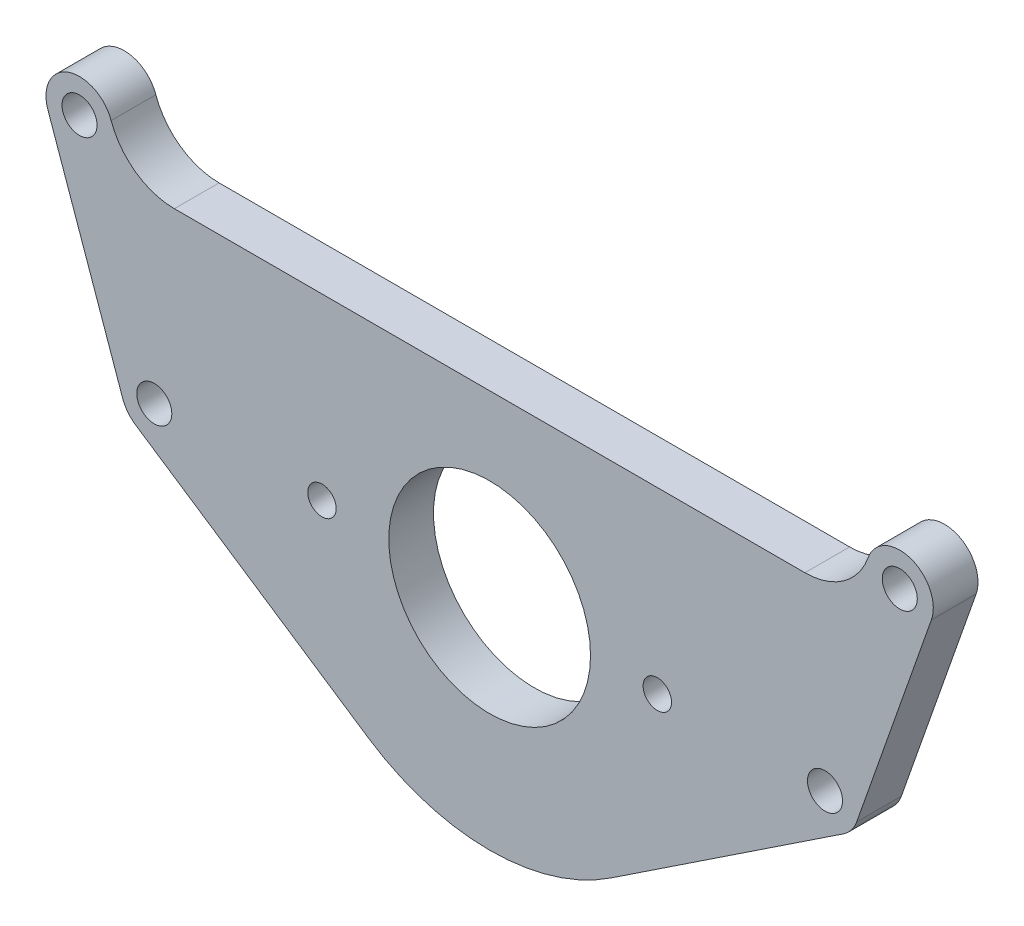
ISO-10303-21;
HEADER;
FILE_DESCRIPTION(('STEP AP214'),'2;1');
FILE_NAME('part.step','',(''),(''),'','','');
FILE_SCHEMA(('AUTOMOTIVE_DESIGN { 1 0 10303 214 1 1 1 1 }'));
ENDSEC;
DATA;
#1=APPLICATION_CONTEXT('core data for automotive mechanical design processes');
#2=APPLICATION_PROTOCOL_DEFINITION('international standard','automotive_design',2000,#1);
#3=PRODUCT_CONTEXT('',#1,'mechanical');
#4=PRODUCT('Part','Part','',(#3));
#5=PRODUCT_RELATED_PRODUCT_CATEGORY('part','',(#4));
#6=PRODUCT_DEFINITION_FORMATION('','',#4);
#7=PRODUCT_DEFINITION_CONTEXT('part definition',#1,'design');
#8=PRODUCT_DEFINITION('design','',#6,#7);
#9=PRODUCT_DEFINITION_SHAPE('','',#8);
#10=(LENGTH_UNIT() NAMED_UNIT(*) SI_UNIT(.MILLI.,.METRE.));
#11=(NAMED_UNIT(*) PLANE_ANGLE_UNIT() SI_UNIT($,.RADIAN.));
#12=(NAMED_UNIT(*) SI_UNIT($,.STERADIAN.) SOLID_ANGLE_UNIT());
#13=UNCERTAINTY_MEASURE_WITH_UNIT(LENGTH_MEASURE(1.E-05),#10,'distance_accuracy_value','');
#14=(GEOMETRIC_REPRESENTATION_CONTEXT(3) GLOBAL_UNCERTAINTY_ASSIGNED_CONTEXT((#13)) GLOBAL_UNIT_ASSIGNED_CONTEXT((#10,
#11,#12)) REPRESENTATION_CONTEXT('',''));
#15=CARTESIAN_POINT('',(0.,0.,0.));
#16=DIRECTION('',(0.,0.,1.));
#17=DIRECTION('',(1.,0.,0.));
#18=AXIS2_PLACEMENT_3D('',#15,#16,#17);
#19=CARTESIAN_POINT('',(-46.8683654343327,-16.4952616511986,6.35));
#20=DIRECTION('',(-0.943283776188095,-0.331987526242067,0.));
#21=DIRECTION('',(0.331987526242067,-0.943283776188095,0.));
#22=AXIS2_PLACEMENT_3D('',#19,#20,#21);
#23=PLANE('',#22);
#24=DIRECTION('',(-0.331987526242067,0.943283776188095,0.));
#25=VECTOR('',#24,1.);
#26=CARTESIAN_POINT('',(-46.8683654343327,-16.4952616511986,0.));
#27=LINE('',#26,#25);
#28=CARTESIAN_POINT('',(-52.1173889840958,-1.58109059372788,0.));
#29=VERTEX_POINT('',#28);
#30=CARTESIAN_POINT('',(-62.7330425265984,28.5814094062722,0.));
#31=VERTEX_POINT('',#30);
#32=EDGE_CURVE('E178',#29,#31,#27,.T.);
#33=ORIENTED_EDGE('',*,*,#32,.F.);
#34=DIRECTION('',(0.,0.,-1.));
#35=VECTOR('',#34,1.);
#36=CARTESIAN_POINT('',(-52.1173889840958,-1.58109059372788,6.35));
#37=LINE('',#36,#35);
#38=CARTESIAN_POINT('',(-52.1173889840958,-1.58109059372788,6.35));
#39=VERTEX_POINT('',#38);
#40=EDGE_CURVE('E11',#39,#29,#37,.T.);
#41=ORIENTED_EDGE('',*,*,#40,.F.);
#42=DIRECTION('',(-0.331987526242067,0.943283776188095,0.));
#43=VECTOR('',#42,1.);
#44=CARTESIAN_POINT('',(-46.8683654343327,-16.4952616511986,6.35));
#45=LINE('',#44,#43);
#46=CARTESIAN_POINT('',(-62.7330425265984,28.5814094062722,6.35));
#47=VERTEX_POINT('',#46);
#48=EDGE_CURVE('E229',#39,#47,#45,.T.);
#49=ORIENTED_EDGE('',*,*,#48,.T.);
#50=DIRECTION('',(0.,0.,-1.));
#51=VECTOR('',#50,1.);
#52=CARTESIAN_POINT('',(-62.7330425265984,28.5814094062722,6.35));
#53=LINE('',#52,#51);
#54=EDGE_CURVE('E99',#47,#31,#53,.T.);
#55=ORIENTED_EDGE('',*,*,#54,.T.);
#56=EDGE_LOOP('',(#33,#41,#49,#55));
#57=FACE_BOUND('',#56,.T.);
#58=ADVANCED_FACE('F37',(#57),#23,.T.);
#59=CARTESIAN_POINT('',(-47.625,0.,6.35));
#60=DIRECTION('',(0.,0.,-1.));
#61=DIRECTION('',(-1.,0.,0.));
#62=AXIS2_PLACEMENT_3D('',#59,#60,#61);
#63=CYLINDRICAL_SURFACE('',#62,4.7625);
#64=CARTESIAN_POINT('',(-47.625,0.,0.));
#65=DIRECTION('',(0.,0.,1.));
#66=DIRECTION('',(1.,0.,0.));
#67=AXIS2_PLACEMENT_3D('',#64,#65,#66);
#68=CIRCLE('',#67,4.7625);
#69=CARTESIAN_POINT('',(-50.26025,-3.96697160154951,0.));
#70=VERTEX_POINT('',#69);
#71=EDGE_CURVE('E181',#29,#70,#68,.T.);
#72=ORIENTED_EDGE('',*,*,#71,.T.);
#73=DIRECTION('',(0.,0.,-1.));
#74=VECTOR('',#73,1.);
#75=CARTESIAN_POINT('',(-50.26025,-3.96697160154951,6.35));
#76=LINE('',#75,#74);
#77=CARTESIAN_POINT('',(-50.26025,-3.96697160154951,6.35));
#78=VERTEX_POINT('',#77);
#79=EDGE_CURVE('E45',#78,#70,#76,.T.);
#80=ORIENTED_EDGE('',*,*,#79,.F.);
#81=CARTESIAN_POINT('',(-47.625,0.,6.35));
#82=DIRECTION('',(0.,0.,1.));
#83=DIRECTION('',(1.,0.,0.));
#84=AXIS2_PLACEMENT_3D('',#81,#82,#83);
#85=CIRCLE('',#84,4.7625);
#86=EDGE_CURVE('E291',#39,#78,#85,.T.);
#87=ORIENTED_EDGE('',*,*,#86,.F.);
#88=ORIENTED_EDGE('',*,*,#40,.T.);
#89=EDGE_LOOP('',(#72,#80,#87,#88));
#90=FACE_BOUND('',#89,.T.);
#91=ADVANCED_FACE('F254',(#90),#63,.T.);
#92=CARTESIAN_POINT('',(-17.2169666666667,-25.9175477967899,6.35));
#93=DIRECTION('',(-0.553333333333333,-0.832959916335848,0.));
#94=DIRECTION('',(0.832959916335848,-0.553333333333333,0.));
#95=AXIS2_PLACEMENT_3D('',#92,#93,#94);
#96=PLANE('',#95);
#97=DIRECTION('',(-0.832959916335848,0.553333333333333,0.));
#98=VECTOR('',#97,1.);
#99=CARTESIAN_POINT('',(-17.2169666666667,-25.9175477967899,0.));
#100=LINE('',#99,#98);
#101=CARTESIAN_POINT('',(-17.2169666666666,-25.9175477967899,0.));
#102=VERTEX_POINT('',#101);
#103=EDGE_CURVE('E184',#102,#70,#100,.T.);
#104=ORIENTED_EDGE('',*,*,#103,.F.);
#105=DIRECTION('',(0.,0.,-1.));
#106=VECTOR('',#105,1.);
#107=CARTESIAN_POINT('',(-17.2169666666666,-25.9175477967899,6.35));
#108=LINE('',#107,#106);
#109=CARTESIAN_POINT('',(-17.2169666666666,-25.9175477967899,6.35));
#110=VERTEX_POINT('',#109);
#111=EDGE_CURVE('E244',#110,#102,#108,.T.);
#112=ORIENTED_EDGE('',*,*,#111,.F.);
#113=DIRECTION('',(-0.832959916335848,0.553333333333333,0.));
#114=VECTOR('',#113,1.);
#115=CARTESIAN_POINT('',(-17.2169666666667,-25.9175477967899,6.35));
#116=LINE('',#115,#114);
#117=EDGE_CURVE('E251',#110,#78,#116,.T.);
#118=ORIENTED_EDGE('',*,*,#117,.T.);
#119=ORIENTED_EDGE('',*,*,#79,.T.);
#120=EDGE_LOOP('',(#104,#112,#118,#119));
#121=FACE_BOUND('',#120,.T.);
#122=ADVANCED_FACE('F249',(#121),#96,.T.);
#123=CARTESIAN_POINT('',(0.,0.,6.35));
#124=DIRECTION('',(0.,0.,-1.));
#125=DIRECTION('',(-1.,0.,0.));
#126=AXIS2_PLACEMENT_3D('',#123,#124,#125);
#127=CYLINDRICAL_SURFACE('',#126,31.115);
#128=CARTESIAN_POINT('',(0.,0.,0.));
#129=DIRECTION('',(0.,0.,1.));
#130=DIRECTION('',(1.,0.,0.));
#131=AXIS2_PLACEMENT_3D('',#128,#129,#130);
#132=CIRCLE('',#131,31.115);
#133=CARTESIAN_POINT('',(17.2169666666666,-25.9175477967899,0.));
#134=VERTEX_POINT('',#133);
#135=EDGE_CURVE('E187',#102,#134,#132,.T.);
#136=ORIENTED_EDGE('',*,*,#135,.T.);
#137=DIRECTION('',(0.,0.,-1.));
#138=VECTOR('',#137,1.);
#139=CARTESIAN_POINT('',(17.2169666666666,-25.9175477967899,6.35));
#140=LINE('',#139,#138);
#141=CARTESIAN_POINT('',(17.2169666666666,-25.9175477967899,6.35));
#142=VERTEX_POINT('',#141);
#143=EDGE_CURVE('E241',#142,#134,#140,.T.);
#144=ORIENTED_EDGE('',*,*,#143,.F.);
#145=CARTESIAN_POINT('',(0.,0.,6.35));
#146=DIRECTION('',(0.,0.,1.));
#147=DIRECTION('',(1.,0.,0.));
#148=AXIS2_PLACEMENT_3D('',#145,#146,#147);
#149=CIRCLE('',#148,31.115);
#150=EDGE_CURVE('E272',#110,#142,#149,.T.);
#151=ORIENTED_EDGE('',*,*,#150,.F.);
#152=ORIENTED_EDGE('',*,*,#111,.T.);
#153=EDGE_LOOP('',(#136,#144,#151,#152));
#154=FACE_BOUND('',#153,.T.);
#155=ADVANCED_FACE('F262',(#154),#127,.T.);
#156=CARTESIAN_POINT('',(17.2169666666667,-25.9175477967899,6.35));
#157=DIRECTION('',(-0.553333333333333,0.832959916335848,0.));
#158=DIRECTION('',(-0.832959916335848,-0.553333333333333,0.));
#159=AXIS2_PLACEMENT_3D('',#156,#157,#158);
#160=PLANE('',#159);
#161=DIRECTION('',(0.832959916335848,0.553333333333333,0.));
#162=VECTOR('',#161,1.);
#163=CARTESIAN_POINT('',(17.2169666666667,-25.9175477967899,0.));
#164=LINE('',#163,#162);
#165=CARTESIAN_POINT('',(50.26025,-3.96697160154951,0.));
#166=VERTEX_POINT('',#165);
#167=EDGE_CURVE('E189',#134,#166,#164,.T.);
#168=ORIENTED_EDGE('',*,*,#167,.T.);
#169=DIRECTION('',(0.,0.,-1.));
#170=VECTOR('',#169,1.);
#171=CARTESIAN_POINT('',(50.26025,-3.96697160154951,6.35));
#172=LINE('',#171,#170);
#173=CARTESIAN_POINT('',(50.26025,-3.96697160154951,6.35));
#174=VERTEX_POINT('',#173);
#175=EDGE_CURVE('E239',#174,#166,#172,.T.);
#176=ORIENTED_EDGE('',*,*,#175,.F.);
#177=DIRECTION('',(0.832959916335848,0.553333333333333,0.));
#178=VECTOR('',#177,1.);
#179=CARTESIAN_POINT('',(17.2169666666667,-25.9175477967899,6.35));
#180=LINE('',#179,#178);
#181=EDGE_CURVE('E268',#142,#174,#180,.T.);
#182=ORIENTED_EDGE('',*,*,#181,.F.);
#183=ORIENTED_EDGE('',*,*,#143,.T.);
#184=EDGE_LOOP('',(#168,#176,#182,#183));
#185=FACE_BOUND('',#184,.T.);
#186=ADVANCED_FACE('F266',(#185),#160,.F.);
#187=CARTESIAN_POINT('',(47.625,0.,6.35));
#188=DIRECTION('',(0.,0.,-1.));
#189=DIRECTION('',(-1.,0.,0.));
#190=AXIS2_PLACEMENT_3D('',#187,#188,#189);
#191=CYLINDRICAL_SURFACE('',#190,4.7625);
#192=CARTESIAN_POINT('',(47.625,0.,0.));
#193=DIRECTION('',(0.,0.,1.));
#194=DIRECTION('',(1.,0.,0.));
#195=AXIS2_PLACEMENT_3D('',#192,#193,#194);
#196=CIRCLE('',#195,4.7625);
#197=CARTESIAN_POINT('',(52.1173889840958,-1.58109059372788,0.));
#198=VERTEX_POINT('',#197);
#199=EDGE_CURVE('E192',#198,#166,#196,.F.);
#200=ORIENTED_EDGE('',*,*,#199,.F.);
#201=DIRECTION('',(0.,0.,-1.));
#202=VECTOR('',#201,1.);
#203=CARTESIAN_POINT('',(52.1173889840958,-1.58109059372788,6.35));
#204=LINE('',#203,#202);
#205=CARTESIAN_POINT('',(52.1173889840958,-1.58109059372788,6.35));
#206=VERTEX_POINT('',#205);
#207=EDGE_CURVE('E237',#206,#198,#204,.T.);
#208=ORIENTED_EDGE('',*,*,#207,.F.);
#209=CARTESIAN_POINT('',(47.625,0.,6.35));
#210=DIRECTION('',(0.,0.,1.));
#211=DIRECTION('',(1.,0.,0.));
#212=AXIS2_PLACEMENT_3D('',#209,#210,#211);
#213=CIRCLE('',#212,4.7625);
#214=EDGE_CURVE('E271',#206,#174,#213,.F.);
#215=ORIENTED_EDGE('',*,*,#214,.T.);
#216=ORIENTED_EDGE('',*,*,#175,.T.);
#217=EDGE_LOOP('',(#200,#208,#215,#216));
#218=FACE_BOUND('',#217,.T.);
#219=ADVANCED_FACE('F307',(#218),#191,.T.);
#220=CARTESIAN_POINT('',(46.8683654343327,-16.4952616511986,6.35));
#221=DIRECTION('',(-0.943283776188095,0.331987526242067,0.));
#222=DIRECTION('',(-0.331987526242067,-0.943283776188095,0.));
#223=AXIS2_PLACEMENT_3D('',#220,#221,#222);
#224=PLANE('',#223);
#225=DIRECTION('',(0.331987526242067,0.943283776188095,0.));
#226=VECTOR('',#225,1.);
#227=CARTESIAN_POINT('',(46.8683654343327,-16.4952616511986,0.));
#228=LINE('',#227,#226);
#229=CARTESIAN_POINT('',(62.7330425265984,28.5814094062722,0.));
#230=VERTEX_POINT('',#229);
#231=EDGE_CURVE('E195',#198,#230,#228,.T.);
#232=ORIENTED_EDGE('',*,*,#231,.T.);
#233=DIRECTION('',(0.,0.,-1.));
#234=VECTOR('',#233,1.);
#235=CARTESIAN_POINT('',(62.7330425265984,28.5814094062722,6.35));
#236=LINE('',#235,#234);
#237=CARTESIAN_POINT('',(62.7330425265984,28.5814094062722,6.35));
#238=VERTEX_POINT('',#237);
#239=EDGE_CURVE('E235',#238,#230,#236,.T.);
#240=ORIENTED_EDGE('',*,*,#239,.F.);
#241=DIRECTION('',(0.331987526242067,0.943283776188095,0.));
#242=VECTOR('',#241,1.);
#243=CARTESIAN_POINT('',(46.8683654343327,-16.4952616511986,6.35));
#244=LINE('',#243,#242);
#245=EDGE_CURVE('E274',#206,#238,#244,.T.);
#246=ORIENTED_EDGE('',*,*,#245,.F.);
#247=ORIENTED_EDGE('',*,*,#207,.T.);
#248=EDGE_LOOP('',(#232,#240,#246,#247));
#249=FACE_BOUND('',#248,.T.);
#250=ADVANCED_FACE('F310',(#249),#224,.F.);
#251=CARTESIAN_POINT('',(58.2406535425026,30.1625,6.35));
#252=DIRECTION('',(0.,0.,-1.));
#253=DIRECTION('',(-1.,0.,0.));
#254=AXIS2_PLACEMENT_3D('',#251,#252,#253);
#255=CYLINDRICAL_SURFACE('',#254,4.7625);
#256=CARTESIAN_POINT('',(58.2406535425026,30.1625,0.));
#257=DIRECTION('',(0.,0.,1.));
#258=DIRECTION('',(1.,0.,0.));
#259=AXIS2_PLACEMENT_3D('',#256,#257,#258);
#260=CIRCLE('',#259,4.7625);
#261=CARTESIAN_POINT('',(53.750525481968,31.75,0.));
#262=VERTEX_POINT('',#261);
#263=EDGE_CURVE('E198',#262,#230,#260,.F.);
#264=ORIENTED_EDGE('',*,*,#263,.F.);
#265=DIRECTION('',(0.,0.,-1.));
#266=VECTOR('',#265,1.);
#267=CARTESIAN_POINT('',(53.750525481968,31.75,6.35));
#268=LINE('',#267,#266);
#269=CARTESIAN_POINT('',(53.750525481968,31.75,6.35));
#270=VERTEX_POINT('',#269);
#271=EDGE_CURVE('E233',#270,#262,#268,.T.);
#272=ORIENTED_EDGE('',*,*,#271,.F.);
#273=CARTESIAN_POINT('',(58.2406535425026,30.1625,6.35));
#274=DIRECTION('',(0.,0.,1.));
#275=DIRECTION('',(1.,0.,0.));
#276=AXIS2_PLACEMENT_3D('',#273,#274,#275);
#277=CIRCLE('',#276,4.7625);
#278=EDGE_CURVE('E152',#270,#238,#277,.F.);
#279=ORIENTED_EDGE('',*,*,#278,.T.);
#280=ORIENTED_EDGE('',*,*,#239,.T.);
#281=EDGE_LOOP('',(#264,#272,#279,#280));
#282=FACE_BOUND('',#281,.T.);
#283=ADVANCED_FACE('F282',(#282),#255,.T.);
#284=CARTESIAN_POINT('',(44.7702693608988,34.925,6.35));
#285=DIRECTION('',(0.,0.,-1.));
#286=DIRECTION('',(-1.,0.,0.));
#287=AXIS2_PLACEMENT_3D('',#284,#285,#286);
#288=CYLINDRICAL_SURFACE('',#287,9.525);
#289=CARTESIAN_POINT('',(44.7702693608988,34.925,0.));
#290=DIRECTION('',(0.,0.,1.));
#291=DIRECTION('',(1.,0.,0.));
#292=AXIS2_PLACEMENT_3D('',#289,#290,#291);
#293=CIRCLE('',#292,9.525);
#294=CARTESIAN_POINT('',(44.7702693608988,25.4,0.));
#295=VERTEX_POINT('',#294);
#296=EDGE_CURVE('E201',#295,#262,#293,.T.);
#297=ORIENTED_EDGE('',*,*,#296,.F.);
#298=DIRECTION('',(0.,0.,-1.));
#299=VECTOR('',#298,1.);
#300=CARTESIAN_POINT('',(44.7702693608988,25.4,6.35));
#301=LINE('',#300,#299);
#302=CARTESIAN_POINT('',(44.7702693608988,25.4,6.35));
#303=VERTEX_POINT('',#302);
#304=EDGE_CURVE('E139',#303,#295,#301,.T.);
#305=ORIENTED_EDGE('',*,*,#304,.F.);
#306=CARTESIAN_POINT('',(44.7702693608988,34.925,6.35));
#307=DIRECTION('',(0.,0.,1.));
#308=DIRECTION('',(1.,0.,0.));
#309=AXIS2_PLACEMENT_3D('',#306,#307,#308);
#310=CIRCLE('',#309,9.525);
#311=EDGE_CURVE('E150',#303,#270,#310,.T.);
#312=ORIENTED_EDGE('',*,*,#311,.T.);
#313=ORIENTED_EDGE('',*,*,#271,.T.);
#314=EDGE_LOOP('',(#297,#305,#312,#313));
#315=FACE_BOUND('',#314,.T.);
#316=ADVANCED_FACE('F287',(#315),#288,.F.);
#317=CARTESIAN_POINT('',(0.,25.4,6.35));
#318=DIRECTION('',(0.,1.,0.));
#319=DIRECTION('',(0.,0.,1.));
#320=AXIS2_PLACEMENT_3D('',#317,#318,#319);
#321=PLANE('',#320);
#322=DIRECTION('',(1.,0.,0.));
#323=VECTOR('',#322,1.);
#324=CARTESIAN_POINT('',(0.,25.4,0.));
#325=LINE('',#324,#323);
#326=CARTESIAN_POINT('',(-44.7702693608988,25.4,0.));
#327=VERTEX_POINT('',#326);
#328=EDGE_CURVE('E138',#327,#295,#325,.T.);
#329=ORIENTED_EDGE('',*,*,#328,.F.);
#330=DIRECTION('',(0.,0.,-1.));
#331=VECTOR('',#330,1.);
#332=CARTESIAN_POINT('',(-44.7702693608988,25.4,6.35));
#333=LINE('',#332,#331);
#334=CARTESIAN_POINT('',(-44.7702693608988,25.4,6.35));
#335=VERTEX_POINT('',#334);
#336=EDGE_CURVE('E132',#335,#327,#333,.T.);
#337=ORIENTED_EDGE('',*,*,#336,.F.);
#338=DIRECTION('',(1.,0.,0.));
#339=VECTOR('',#338,1.);
#340=CARTESIAN_POINT('',(0.,25.4,6.35));
#341=LINE('',#340,#339);
#342=EDGE_CURVE('E136',#335,#303,#341,.T.);
#343=ORIENTED_EDGE('',*,*,#342,.T.);
#344=ORIENTED_EDGE('',*,*,#304,.T.);
#345=EDGE_LOOP('',(#329,#337,#343,#344));
#346=FACE_BOUND('',#345,.T.);
#347=ADVANCED_FACE('F134',(#346),#321,.T.);
#348=CARTESIAN_POINT('',(-44.7702693608988,34.925,6.35));
#349=DIRECTION('',(0.,0.,-1.));
#350=DIRECTION('',(-1.,0.,0.));
#351=AXIS2_PLACEMENT_3D('',#348,#349,#350);
#352=CYLINDRICAL_SURFACE('',#351,9.525);
#353=CARTESIAN_POINT('',(-44.7702693608988,34.925,0.));
#354=DIRECTION('',(0.,0.,1.));
#355=DIRECTION('',(1.,0.,0.));
#356=AXIS2_PLACEMENT_3D('',#353,#354,#355);
#357=CIRCLE('',#356,9.525);
#358=CARTESIAN_POINT('',(-53.750525481968,31.75,0.));
#359=VERTEX_POINT('',#358);
#360=EDGE_CURVE('E92',#327,#359,#357,.F.);
#361=ORIENTED_EDGE('',*,*,#360,.T.);
#362=DIRECTION('',(0.,0.,-1.));
#363=VECTOR('',#362,1.);
#364=CARTESIAN_POINT('',(-53.750525481968,31.75,6.35));
#365=LINE('',#364,#363);
#366=CARTESIAN_POINT('',(-53.750525481968,31.75,6.35));
#367=VERTEX_POINT('',#366);
#368=EDGE_CURVE('E140',#367,#359,#365,.T.);
#369=ORIENTED_EDGE('',*,*,#368,.F.);
#370=CARTESIAN_POINT('',(-44.7702693608988,34.925,6.35));
#371=DIRECTION('',(0.,0.,1.));
#372=DIRECTION('',(1.,0.,0.));
#373=AXIS2_PLACEMENT_3D('',#370,#371,#372);
#374=CIRCLE('',#373,9.525);
#375=EDGE_CURVE('E142',#335,#367,#374,.F.);
#376=ORIENTED_EDGE('',*,*,#375,.F.);
#377=ORIENTED_EDGE('',*,*,#336,.T.);
#378=EDGE_LOOP('',(#361,#369,#376,#377));
#379=FACE_BOUND('',#378,.T.);
#380=ADVANCED_FACE('F143',(#379),#352,.F.);
#381=CARTESIAN_POINT('',(47.625,0.,6.35));
#382=DIRECTION('',(0.,0.,-1.));
#383=DIRECTION('',(-1.,0.,0.));
#384=AXIS2_PLACEMENT_3D('',#381,#382,#383);
#385=CYLINDRICAL_SURFACE('',#384,2.4892);
#386=CARTESIAN_POINT('',(47.625,0.,6.35));
#387=DIRECTION('',(0.,0.,1.));
#388=DIRECTION('',(1.,0.,0.));
#389=AXIS2_PLACEMENT_3D('',#386,#387,#388);
#390=CIRCLE('',#389,2.4892);
#391=CARTESIAN_POINT('',(50.1142,0.,6.35));
#392=VERTEX_POINT('',#391);
#393=EDGE_CURVE('E172',#392,#392,#390,.T.);
#394=ORIENTED_EDGE('',*,*,#393,.T.);
#395=EDGE_LOOP('',(#394));
#396=FACE_BOUND('',#395,.T.);
#397=CARTESIAN_POINT('',(47.625,0.,0.));
#398=DIRECTION('',(0.,0.,1.));
#399=DIRECTION('',(1.,0.,0.));
#400=AXIS2_PLACEMENT_3D('',#397,#398,#399);
#401=CIRCLE('',#400,2.4892);
#402=CARTESIAN_POINT('',(50.1142,0.,0.));
#403=VERTEX_POINT('',#402);
#404=EDGE_CURVE('E223',#403,#403,#401,.T.);
#405=ORIENTED_EDGE('',*,*,#404,.F.);
#406=EDGE_LOOP('',(#405));
#407=FACE_BOUND('',#406,.T.);
#408=ADVANCED_FACE('F323',(#396,#407),#385,.F.);
#409=CARTESIAN_POINT('',(-47.625,0.,6.35));
#410=DIRECTION('',(0.,0.,-1.));
#411=DIRECTION('',(-1.,0.,0.));
#412=AXIS2_PLACEMENT_3D('',#409,#410,#411);
#413=CYLINDRICAL_SURFACE('',#412,2.4892);
#414=CARTESIAN_POINT('',(-47.625,0.,6.35));
#415=DIRECTION('',(0.,0.,1.));
#416=DIRECTION('',(1.,0.,0.));
#417=AXIS2_PLACEMENT_3D('',#414,#415,#416);
#418=CIRCLE('',#417,2.4892);
#419=CARTESIAN_POINT('',(-45.1358,0.,6.35));
#420=VERTEX_POINT('',#419);
#421=EDGE_CURVE('E169',#420,#420,#418,.T.);
#422=ORIENTED_EDGE('',*,*,#421,.T.);
#423=EDGE_LOOP('',(#422));
#424=FACE_BOUND('',#423,.T.);
#425=CARTESIAN_POINT('',(-47.625,0.,0.));
#426=DIRECTION('',(0.,0.,1.));
#427=DIRECTION('',(1.,0.,0.));
#428=AXIS2_PLACEMENT_3D('',#425,#426,#427);
#429=CIRCLE('',#428,2.4892);
#430=CARTESIAN_POINT('',(-45.1358,0.,0.));
#431=VERTEX_POINT('',#430);
#432=EDGE_CURVE('E220',#431,#431,#429,.T.);
#433=ORIENTED_EDGE('',*,*,#432,.F.);
#434=EDGE_LOOP('',(#433));
#435=FACE_BOUND('',#434,.T.);
#436=ADVANCED_FACE('F342',(#424,#435),#413,.F.);
#437=CARTESIAN_POINT('',(23.8125,0.,6.35));
#438=DIRECTION('',(0.,0.,-1.));
#439=DIRECTION('',(-1.,0.,0.));
#440=AXIS2_PLACEMENT_3D('',#437,#438,#439);
#441=CYLINDRICAL_SURFACE('',#440,2.0193);
#442=CARTESIAN_POINT('',(23.8125,0.,6.35));
#443=DIRECTION('',(0.,0.,1.));
#444=DIRECTION('',(1.,0.,0.));
#445=AXIS2_PLACEMENT_3D('',#442,#443,#444);
#446=CIRCLE('',#445,2.0193);
#447=CARTESIAN_POINT('',(25.8318,0.,6.35));
#448=VERTEX_POINT('',#447);
#449=EDGE_CURVE('E166',#448,#448,#446,.F.);
#450=ORIENTED_EDGE('',*,*,#449,.F.);
#451=EDGE_LOOP('',(#450));
#452=FACE_BOUND('',#451,.T.);
#453=CARTESIAN_POINT('',(23.8125,0.,0.));
#454=DIRECTION('',(0.,0.,1.));
#455=DIRECTION('',(1.,0.,0.));
#456=AXIS2_PLACEMENT_3D('',#453,#454,#455);
#457=CIRCLE('',#456,2.0193);
#458=CARTESIAN_POINT('',(25.8318,0.,0.));
#459=VERTEX_POINT('',#458);
#460=EDGE_CURVE('E217',#459,#459,#457,.F.);
#461=ORIENTED_EDGE('',*,*,#460,.T.);
#462=EDGE_LOOP('',(#461));
#463=FACE_BOUND('',#462,.T.);
#464=ADVANCED_FACE('F338',(#452,#463),#441,.F.);
#465=CARTESIAN_POINT('',(-23.8125,0.,6.35));
#466=DIRECTION('',(0.,0.,-1.));
#467=DIRECTION('',(-1.,0.,0.));
#468=AXIS2_PLACEMENT_3D('',#465,#466,#467);
#469=CYLINDRICAL_SURFACE('',#468,2.0193);
#470=CARTESIAN_POINT('',(-23.8125,0.,6.35));
#471=DIRECTION('',(0.,0.,1.));
#472=DIRECTION('',(1.,0.,0.));
#473=AXIS2_PLACEMENT_3D('',#470,#471,#472);
#474=CIRCLE('',#473,2.0193);
#475=CARTESIAN_POINT('',(-21.7932,0.,6.35));
#476=VERTEX_POINT('',#475);
#477=EDGE_CURVE('E163',#476,#476,#474,.T.);
#478=ORIENTED_EDGE('',*,*,#477,.T.);
#479=EDGE_LOOP('',(#478));
#480=FACE_BOUND('',#479,.T.);
#481=CARTESIAN_POINT('',(-23.8125,0.,0.));
#482=DIRECTION('',(0.,0.,1.));
#483=DIRECTION('',(1.,0.,0.));
#484=AXIS2_PLACEMENT_3D('',#481,#482,#483);
#485=CIRCLE('',#484,2.0193);
#486=CARTESIAN_POINT('',(-21.7932,0.,0.));
#487=VERTEX_POINT('',#486);
#488=EDGE_CURVE('E214',#487,#487,#485,.T.);
#489=ORIENTED_EDGE('',*,*,#488,.F.);
#490=EDGE_LOOP('',(#489));
#491=FACE_BOUND('',#490,.T.);
#492=ADVANCED_FACE('F334',(#480,#491),#469,.F.);
#493=CARTESIAN_POINT('',(0.,0.,6.35));
#494=DIRECTION('',(0.,0.,-1.));
#495=DIRECTION('',(-1.,0.,0.));
#496=AXIS2_PLACEMENT_3D('',#493,#494,#495);
#497=CYLINDRICAL_SURFACE('',#496,14.3256);
#498=CARTESIAN_POINT('',(0.,0.,6.35));
#499=DIRECTION('',(0.,0.,1.));
#500=DIRECTION('',(1.,0.,0.));
#501=AXIS2_PLACEMENT_3D('',#498,#499,#500);
#502=CIRCLE('',#501,14.3256);
#503=CARTESIAN_POINT('',(14.3256,0.,6.35));
#504=VERTEX_POINT('',#503);
#505=EDGE_CURVE('E160',#504,#504,#502,.T.);
#506=ORIENTED_EDGE('',*,*,#505,.T.);
#507=EDGE_LOOP('',(#506));
#508=FACE_BOUND('',#507,.T.);
#509=CARTESIAN_POINT('',(0.,0.,0.));
#510=DIRECTION('',(0.,0.,1.));
#511=DIRECTION('',(1.,0.,0.));
#512=AXIS2_PLACEMENT_3D('',#509,#510,#511);
#513=CIRCLE('',#512,14.3256);
#514=CARTESIAN_POINT('',(14.3256,0.,0.));
#515=VERTEX_POINT('',#514);
#516=EDGE_CURVE('E211',#515,#515,#513,.T.);
#517=ORIENTED_EDGE('',*,*,#516,.F.);
#518=EDGE_LOOP('',(#517));
#519=FACE_BOUND('',#518,.T.);
#520=ADVANCED_FACE('F330',(#508,#519),#497,.F.);
#521=CARTESIAN_POINT('',(-58.2406535425026,30.1625,6.35));
#522=DIRECTION('',(0.,0.,-1.));
#523=DIRECTION('',(-1.,0.,0.));
#524=AXIS2_PLACEMENT_3D('',#521,#522,#523);
#525=CYLINDRICAL_SURFACE('',#524,2.48920000000002);
#526=CARTESIAN_POINT('',(-58.2406535425026,30.1625,6.35));
#527=DIRECTION('',(0.,0.,1.));
#528=DIRECTION('',(1.,0.,0.));
#529=AXIS2_PLACEMENT_3D('',#526,#527,#528);
#530=CIRCLE('',#529,2.48920000000002);
#531=CARTESIAN_POINT('',(-55.7514535425026,30.1625,6.35));
#532=VERTEX_POINT('',#531);
#533=EDGE_CURVE('E157',#532,#532,#530,.T.);
#534=ORIENTED_EDGE('',*,*,#533,.T.);
#535=EDGE_LOOP('',(#534));
#536=FACE_BOUND('',#535,.T.);
#537=CARTESIAN_POINT('',(-58.2406535425026,30.1625,0.));
#538=DIRECTION('',(0.,0.,1.));
#539=DIRECTION('',(1.,0.,0.));
#540=AXIS2_PLACEMENT_3D('',#537,#538,#539);
#541=CIRCLE('',#540,2.48920000000002);
#542=CARTESIAN_POINT('',(-55.7514535425026,30.1625,0.));
#543=VERTEX_POINT('',#542);
#544=EDGE_CURVE('E208',#543,#543,#541,.T.);
#545=ORIENTED_EDGE('',*,*,#544,.F.);
#546=EDGE_LOOP('',(#545));
#547=FACE_BOUND('',#546,.T.);
#548=ADVANCED_FACE('F327',(#536,#547),#525,.F.);
#549=CARTESIAN_POINT('',(-58.2406535425026,30.1625,6.35));
#550=DIRECTION('',(0.,0.,-1.));
#551=DIRECTION('',(-1.,0.,0.));
#552=AXIS2_PLACEMENT_3D('',#549,#550,#551);
#553=CYLINDRICAL_SURFACE('',#552,4.7625);
#554=CARTESIAN_POINT('',(-58.2406535425026,30.1625,0.));
#555=DIRECTION('',(0.,0.,1.));
#556=DIRECTION('',(1.,0.,0.));
#557=AXIS2_PLACEMENT_3D('',#554,#555,#556);
#558=CIRCLE('',#557,4.7625);
#559=EDGE_CURVE('E206',#359,#31,#558,.T.);
#560=ORIENTED_EDGE('',*,*,#559,.T.);
#561=ORIENTED_EDGE('',*,*,#54,.F.);
#562=CARTESIAN_POINT('',(-58.2406535425026,30.1625,6.35));
#563=DIRECTION('',(0.,0.,1.));
#564=DIRECTION('',(1.,0.,0.));
#565=AXIS2_PLACEMENT_3D('',#562,#563,#564);
#566=CIRCLE('',#565,4.7625);
#567=EDGE_CURVE('E53',#367,#47,#566,.T.);
#568=ORIENTED_EDGE('',*,*,#567,.F.);
#569=ORIENTED_EDGE('',*,*,#368,.T.);
#570=EDGE_LOOP('',(#560,#561,#568,#569));
#571=FACE_BOUND('',#570,.T.);
#572=ADVANCED_FACE('F290',(#571),#553,.T.);
#573=CARTESIAN_POINT('',(58.2406535425026,30.1625,6.35));
#574=DIRECTION('',(0.,0.,-1.));
#575=DIRECTION('',(-1.,0.,0.));
#576=AXIS2_PLACEMENT_3D('',#573,#574,#575);
#577=CYLINDRICAL_SURFACE('',#576,2.48920000000002);
#578=CARTESIAN_POINT('',(58.2406535425026,30.1625,6.35));
#579=DIRECTION('',(0.,0.,1.));
#580=DIRECTION('',(1.,0.,0.));
#581=AXIS2_PLACEMENT_3D('',#578,#579,#580);
#582=CIRCLE('',#581,2.48920000000002);
#583=CARTESIAN_POINT('',(60.7298535425026,30.1625,6.35));
#584=VERTEX_POINT('',#583);
#585=EDGE_CURVE('E175',#584,#584,#582,.F.);
#586=ORIENTED_EDGE('',*,*,#585,.F.);
#587=EDGE_LOOP('',(#586));
#588=FACE_BOUND('',#587,.T.);
#589=CARTESIAN_POINT('',(58.2406535425026,30.1625,0.));
#590=DIRECTION('',(0.,0.,1.));
#591=DIRECTION('',(1.,0.,0.));
#592=AXIS2_PLACEMENT_3D('',#589,#590,#591);
#593=CIRCLE('',#592,2.48920000000002);
#594=CARTESIAN_POINT('',(60.7298535425026,30.1625,0.));
#595=VERTEX_POINT('',#594);
#596=EDGE_CURVE('E226',#595,#595,#593,.F.);
#597=ORIENTED_EDGE('',*,*,#596,.T.);
#598=EDGE_LOOP('',(#597));
#599=FACE_BOUND('',#598,.T.);
#600=ADVANCED_FACE('F326',(#588,#599),#577,.F.);
#601=CARTESIAN_POINT('',(0.,0.,6.35));
#602=DIRECTION('',(0.,0.,1.));
#603=DIRECTION('',(1.,0.,0.));
#604=AXIS2_PLACEMENT_3D('',#601,#602,#603);
#605=PLANE('',#604);
#606=ORIENTED_EDGE('',*,*,#48,.F.);
#607=ORIENTED_EDGE('',*,*,#86,.T.);
#608=ORIENTED_EDGE('',*,*,#117,.F.);
#609=ORIENTED_EDGE('',*,*,#150,.T.);
#610=ORIENTED_EDGE('',*,*,#181,.T.);
#611=ORIENTED_EDGE('',*,*,#214,.F.);
#612=ORIENTED_EDGE('',*,*,#245,.T.);
#613=ORIENTED_EDGE('',*,*,#278,.F.);
#614=ORIENTED_EDGE('',*,*,#311,.F.);
#615=ORIENTED_EDGE('',*,*,#342,.F.);
#616=ORIENTED_EDGE('',*,*,#375,.T.);
#617=ORIENTED_EDGE('',*,*,#567,.T.);
#618=EDGE_LOOP('',(#606,#607,#608,#609,#610,#611,#612,#613,#614,#615,#616,#617));
#619=FACE_BOUND('',#618,.T.);
#620=ORIENTED_EDGE('',*,*,#533,.F.);
#621=EDGE_LOOP('',(#620));
#622=FACE_BOUND('',#621,.T.);
#623=ORIENTED_EDGE('',*,*,#505,.F.);
#624=EDGE_LOOP('',(#623));
#625=FACE_BOUND('',#624,.T.);
#626=ORIENTED_EDGE('',*,*,#477,.F.);
#627=EDGE_LOOP('',(#626));
#628=FACE_BOUND('',#627,.T.);
#629=ORIENTED_EDGE('',*,*,#449,.T.);
#630=EDGE_LOOP('',(#629));
#631=FACE_BOUND('',#630,.T.);
#632=ORIENTED_EDGE('',*,*,#421,.F.);
#633=EDGE_LOOP('',(#632));
#634=FACE_BOUND('',#633,.T.);
#635=ORIENTED_EDGE('',*,*,#393,.F.);
#636=EDGE_LOOP('',(#635));
#637=FACE_BOUND('',#636,.T.);
#638=ORIENTED_EDGE('',*,*,#585,.T.);
#639=EDGE_LOOP('',(#638));
#640=FACE_BOUND('',#639,.T.);
#641=ADVANCED_FACE('F146',(#619,#622,#625,#628,#631,#634,#637,#640),#605,.T.);
#642=CARTESIAN_POINT('',(0.,0.,0.));
#643=DIRECTION('',(0.,0.,1.));
#644=DIRECTION('',(1.,0.,0.));
#645=AXIS2_PLACEMENT_3D('',#642,#643,#644);
#646=PLANE('',#645);
#647=ORIENTED_EDGE('',*,*,#32,.T.);
#648=ORIENTED_EDGE('',*,*,#559,.F.);
#649=ORIENTED_EDGE('',*,*,#360,.F.);
#650=ORIENTED_EDGE('',*,*,#328,.T.);
#651=ORIENTED_EDGE('',*,*,#296,.T.);
#652=ORIENTED_EDGE('',*,*,#263,.T.);
#653=ORIENTED_EDGE('',*,*,#231,.F.);
#654=ORIENTED_EDGE('',*,*,#199,.T.);
#655=ORIENTED_EDGE('',*,*,#167,.F.);
#656=ORIENTED_EDGE('',*,*,#135,.F.);
#657=ORIENTED_EDGE('',*,*,#103,.T.);
#658=ORIENTED_EDGE('',*,*,#71,.F.);
#659=EDGE_LOOP('',(#647,#648,#649,#650,#651,#652,#653,#654,#655,#656,#657,#658));
#660=FACE_BOUND('',#659,.T.);
#661=ORIENTED_EDGE('',*,*,#544,.T.);
#662=EDGE_LOOP('',(#661));
#663=FACE_BOUND('',#662,.T.);
#664=ORIENTED_EDGE('',*,*,#516,.T.);
#665=EDGE_LOOP('',(#664));
#666=FACE_BOUND('',#665,.T.);
#667=ORIENTED_EDGE('',*,*,#488,.T.);
#668=EDGE_LOOP('',(#667));
#669=FACE_BOUND('',#668,.T.);
#670=ORIENTED_EDGE('',*,*,#460,.F.);
#671=EDGE_LOOP('',(#670));
#672=FACE_BOUND('',#671,.T.);
#673=ORIENTED_EDGE('',*,*,#432,.T.);
#674=EDGE_LOOP('',(#673));
#675=FACE_BOUND('',#674,.T.);
#676=ORIENTED_EDGE('',*,*,#404,.T.);
#677=EDGE_LOOP('',(#676));
#678=FACE_BOUND('',#677,.T.);
#679=ORIENTED_EDGE('',*,*,#596,.F.);
#680=EDGE_LOOP('',(#679));
#681=FACE_BOUND('',#680,.T.);
#682=ADVANCED_FACE('F257',(#660,#663,#666,#669,#672,#675,#678,#681),#646,.F.);
#683=CLOSED_SHELL('',(#58,#91,#122,#155,#186,#219,#250,#283,#316,#347,#380,#408,#436,#464,#492,
#520,#548,#572,#600,#641,#682));
#684=MANIFOLD_SOLID_BREP('B2',#683);
#685=ADVANCED_BREP_SHAPE_REPRESENTATION('',(#18,#684),#14);
#686=SHAPE_DEFINITION_REPRESENTATION(#9,#685);
ENDSEC;
END-ISO-10303-21;
